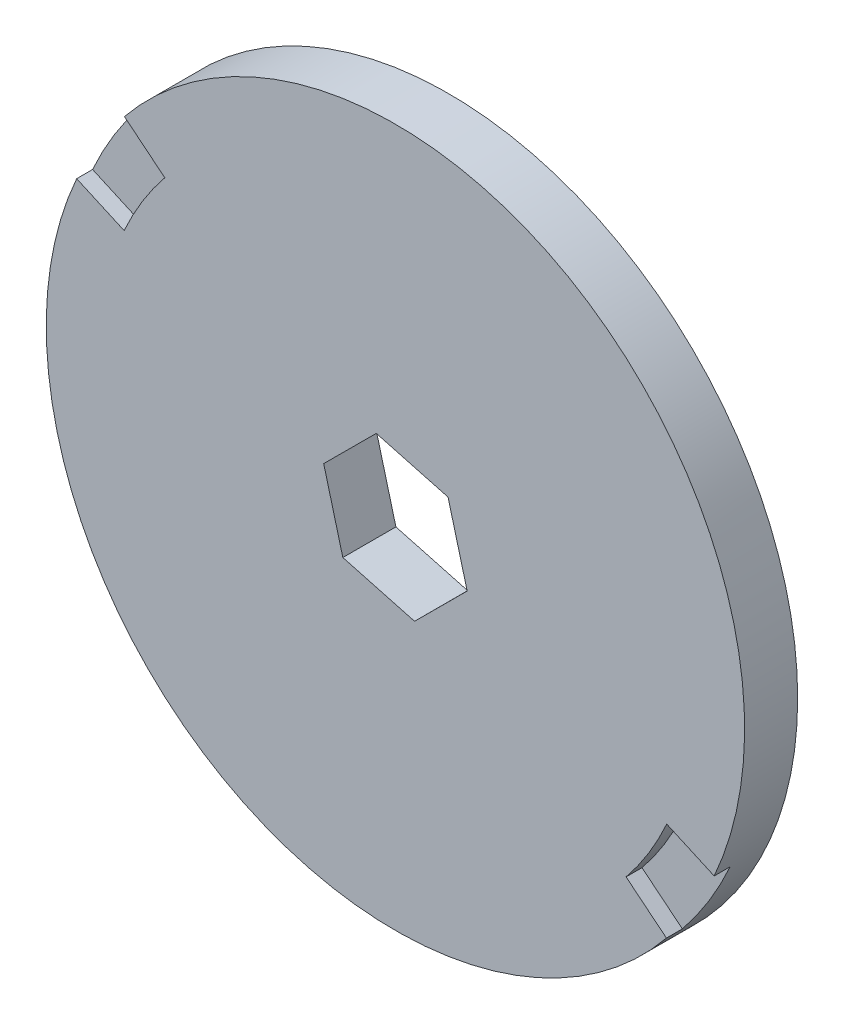
ISO-10303-21;
HEADER;
FILE_DESCRIPTION(('STEP AP214'),'2;1');
FILE_NAME('part.step','',(''),(''),'','','');
FILE_SCHEMA(('AUTOMOTIVE_DESIGN { 1 0 10303 214 1 1 1 1 }'));
ENDSEC;
DATA;
#1=APPLICATION_CONTEXT('core data for automotive mechanical design processes');
#2=APPLICATION_PROTOCOL_DEFINITION('international standard','automotive_design',2000,#1);
#3=PRODUCT_CONTEXT('',#1,'mechanical');
#4=PRODUCT('Part','Part','',(#3));
#5=PRODUCT_RELATED_PRODUCT_CATEGORY('part','',(#4));
#6=PRODUCT_DEFINITION_FORMATION('','',#4);
#7=PRODUCT_DEFINITION_CONTEXT('part definition',#1,'design');
#8=PRODUCT_DEFINITION('design','',#6,#7);
#9=PRODUCT_DEFINITION_SHAPE('','',#8);
#10=(LENGTH_UNIT() NAMED_UNIT(*) SI_UNIT(.MILLI.,.METRE.));
#11=(NAMED_UNIT(*) PLANE_ANGLE_UNIT() SI_UNIT($,.RADIAN.));
#12=(NAMED_UNIT(*) SI_UNIT($,.STERADIAN.) SOLID_ANGLE_UNIT());
#13=UNCERTAINTY_MEASURE_WITH_UNIT(LENGTH_MEASURE(1.E-05),#10,'distance_accuracy_value','');
#14=(GEOMETRIC_REPRESENTATION_CONTEXT(3) GLOBAL_UNCERTAINTY_ASSIGNED_CONTEXT((#13)) GLOBAL_UNIT_ASSIGNED_CONTEXT((#10,
#11,#12)) REPRESENTATION_CONTEXT('',''));
#15=CARTESIAN_POINT('',(0.,0.,0.));
#16=DIRECTION('',(0.,0.,1.));
#17=DIRECTION('',(1.,0.,0.));
#18=AXIS2_PLACEMENT_3D('',#15,#16,#17);
#19=CARTESIAN_POINT('',(0.,0.,5.));
#20=DIRECTION('',(0.,0.,1.));
#21=DIRECTION('',(1.,0.,0.));
#22=AXIS2_PLACEMENT_3D('',#19,#20,#21);
#23=PLANE('',#22);
#24=DIRECTION('',(0.776077913826324,-0.630637036393345,0.));
#25=VECTOR('',#24,1.);
#26=CARTESIAN_POINT('',(21.7301815871371,-17.6578370190137,5.));
#27=LINE('',#26,#25);
#28=CARTESIAN_POINT('',(21.7301815871371,-17.6578370190137,5.));
#29=VERTEX_POINT('',#28);
#30=CARTESIAN_POINT('',(25.532963364886,-20.7479584973411,5.));
#31=VERTEX_POINT('',#30);
#32=EDGE_CURVE('E163',#29,#31,#27,.T.);
#33=ORIENTED_EDGE('',*,*,#32,.F.);
#34=CARTESIAN_POINT('',(0.,0.,5.));
#35=DIRECTION('',(0.,0.,-1.));
#36=DIRECTION('',(1.,0.,0.));
#37=AXIS2_PLACEMENT_3D('',#34,#35,#36);
#38=CIRCLE('',#37,28.);
#39=CARTESIAN_POINT('',(25.5599281208038,-11.4319759647815,5.));
#40=VERTEX_POINT('',#39);
#41=EDGE_CURVE('E271',#40,#29,#38,.T.);
#42=ORIENTED_EDGE('',*,*,#41,.F.);
#43=DIRECTION('',(-0.912854575742995,0.408284855885051,0.));
#44=VECTOR('',#43,1.);
#45=CARTESIAN_POINT('',(30.0329155419445,-13.4325717586182,5.));
#46=LINE('',#45,#44);
#47=CARTESIAN_POINT('',(30.0329155419445,-13.4325717586182,5.));
#48=VERTEX_POINT('',#47);
#49=EDGE_CURVE('E254',#48,#40,#46,.T.);
#50=ORIENTED_EDGE('',*,*,#49,.F.);
#51=CARTESIAN_POINT('',(0.,0.,5.));
#52=DIRECTION('',(0.,0.,1.));
#53=DIRECTION('',(1.,0.,0.));
#54=AXIS2_PLACEMENT_3D('',#51,#52,#53);
#55=CIRCLE('',#54,32.9);
#56=CARTESIAN_POINT('',(-25.532963364886,20.7479584973411,5.));
#57=VERTEX_POINT('',#56);
#58=EDGE_CURVE('E52',#48,#57,#55,.T.);
#59=ORIENTED_EDGE('',*,*,#58,.T.);
#60=DIRECTION('',(-0.776077913826324,0.630637036393345,0.));
#61=VECTOR('',#60,1.);
#62=CARTESIAN_POINT('',(-21.7301815871371,17.6578370190137,5.));
#63=LINE('',#62,#61);
#64=CARTESIAN_POINT('',(-21.7301815871371,17.6578370190137,5.));
#65=VERTEX_POINT('',#64);
#66=EDGE_CURVE('E177',#65,#57,#63,.T.);
#67=ORIENTED_EDGE('',*,*,#66,.F.);
#68=CARTESIAN_POINT('',(0.,0.,5.));
#69=DIRECTION('',(0.,0.,-1.));
#70=DIRECTION('',(-1.,0.,0.));
#71=AXIS2_PLACEMENT_3D('',#68,#69,#70);
#72=CIRCLE('',#71,28.);
#73=CARTESIAN_POINT('',(-25.5599281208038,11.4319759647815,5.));
#74=VERTEX_POINT('',#73);
#75=EDGE_CURVE('E187',#74,#65,#72,.T.);
#76=ORIENTED_EDGE('',*,*,#75,.F.);
#77=DIRECTION('',(0.912854575742995,-0.408284855885051,0.));
#78=VECTOR('',#77,1.);
#79=CARTESIAN_POINT('',(-30.0329155419445,13.4325717586182,5.));
#80=LINE('',#79,#78);
#81=CARTESIAN_POINT('',(-30.0329155419445,13.4325717586182,5.));
#82=VERTEX_POINT('',#81);
#83=EDGE_CURVE('E184',#82,#74,#80,.T.);
#84=ORIENTED_EDGE('',*,*,#83,.F.);
#85=EDGE_CURVE('E11',#82,#31,#55,.T.);
#86=ORIENTED_EDGE('',*,*,#85,.T.);
#87=EDGE_LOOP('',(#33,#42,#50,#59,#67,#76,#84,#86));
#88=FACE_BOUND('',#87,.T.);
#89=DIRECTION('',(-0.25760001608588,0.966251639953358,0.));
#90=VECTOR('',#89,1.);
#91=CARTESIAN_POINT('',(6.75918932283646,-1.82026363421719,5.));
#92=LINE('',#91,#90);
#93=CARTESIAN_POINT('',(6.75918932283646,-1.82026363421719,5.));
#94=VERTEX_POINT('',#93);
#95=CARTESIAN_POINT('',(4.9559892102353,4.94349784545632,5.));
#96=VERTEX_POINT('',#95);
#97=EDGE_CURVE('E203',#94,#96,#92,.T.);
#98=ORIENTED_EDGE('',*,*,#97,.F.);
#99=DIRECTION('',(0.707998458605043,0.706213977922331,0.));
#100=VECTOR('',#99,1.);
#101=CARTESIAN_POINT('',(1.80320011260116,-6.76376147967351,5.));
#102=LINE('',#101,#100);
#103=CARTESIAN_POINT('',(1.80320011260116,-6.76376147967351,5.));
#104=VERTEX_POINT('',#103);
#105=EDGE_CURVE('E201',#104,#94,#102,.T.);
#106=ORIENTED_EDGE('',*,*,#105,.F.);
#107=DIRECTION('',(0.965598474690923,-0.260037662031027,0.));
#108=VECTOR('',#107,1.);
#109=CARTESIAN_POINT('',(-4.9559892102353,-4.94349784545632,5.));
#110=LINE('',#109,#108);
#111=CARTESIAN_POINT('',(-4.9559892102353,-4.94349784545632,5.));
#112=VERTEX_POINT('',#111);
#113=EDGE_CURVE('E213',#112,#104,#110,.T.);
#114=ORIENTED_EDGE('',*,*,#113,.F.);
#115=DIRECTION('',(0.25760001608588,-0.966251639953358,0.));
#116=VECTOR('',#115,1.);
#117=CARTESIAN_POINT('',(-6.75918932283646,1.82026363421719,5.));
#118=LINE('',#117,#116);
#119=CARTESIAN_POINT('',(-6.75918932283646,1.82026363421719,5.));
#120=VERTEX_POINT('',#119);
#121=EDGE_CURVE('E210',#120,#112,#118,.T.);
#122=ORIENTED_EDGE('',*,*,#121,.F.);
#123=DIRECTION('',(-0.707998458605043,-0.706213977922331,0.));
#124=VECTOR('',#123,1.);
#125=CARTESIAN_POINT('',(-1.80320011260116,6.76376147967351,5.));
#126=LINE('',#125,#124);
#127=CARTESIAN_POINT('',(-1.80320011260116,6.76376147967351,5.));
#128=VERTEX_POINT('',#127);
#129=EDGE_CURVE('E208',#128,#120,#126,.T.);
#130=ORIENTED_EDGE('',*,*,#129,.F.);
#131=DIRECTION('',(-0.965598474690923,0.260037662031027,0.));
#132=VECTOR('',#131,1.);
#133=CARTESIAN_POINT('',(4.9559892102353,4.94349784545632,5.));
#134=LINE('',#133,#132);
#135=EDGE_CURVE('E206',#96,#128,#134,.T.);
#136=ORIENTED_EDGE('',*,*,#135,.F.);
#137=EDGE_LOOP('',(#98,#106,#114,#122,#130,#136));
#138=FACE_BOUND('',#137,.T.);
#139=ADVANCED_FACE('F43',(#88,#138),#23,.T.);
#140=CARTESIAN_POINT('',(0.,0.,0.));
#141=DIRECTION('',(0.,0.,1.));
#142=DIRECTION('',(1.,0.,0.));
#143=AXIS2_PLACEMENT_3D('',#140,#141,#142);
#144=PLANE('',#143);
#145=CARTESIAN_POINT('',(0.,0.,0.));
#146=DIRECTION('',(0.,0.,1.));
#147=DIRECTION('',(1.,0.,0.));
#148=AXIS2_PLACEMENT_3D('',#145,#146,#147);
#149=CIRCLE('',#148,32.9);
#150=CARTESIAN_POINT('',(32.9,0.,0.));
#151=VERTEX_POINT('',#150);
#152=EDGE_CURVE('E47',#151,#151,#149,.T.);
#153=ORIENTED_EDGE('',*,*,#152,.F.);
#154=EDGE_LOOP('',(#153));
#155=FACE_BOUND('',#154,.T.);
#156=DIRECTION('',(0.707998458605043,0.706213977922331,0.));
#157=VECTOR('',#156,1.);
#158=CARTESIAN_POINT('',(1.80320011260116,-6.76376147967351,0.));
#159=LINE('',#158,#157);
#160=CARTESIAN_POINT('',(1.80320011260116,-6.76376147967351,0.));
#161=VERTEX_POINT('',#160);
#162=CARTESIAN_POINT('',(6.75918932283646,-1.82026363421719,0.));
#163=VERTEX_POINT('',#162);
#164=EDGE_CURVE('E195',#161,#163,#159,.T.);
#165=ORIENTED_EDGE('',*,*,#164,.T.);
#166=DIRECTION('',(-0.25760001608588,0.966251639953358,0.));
#167=VECTOR('',#166,1.);
#168=CARTESIAN_POINT('',(6.75918932283646,-1.82026363421719,0.));
#169=LINE('',#168,#167);
#170=CARTESIAN_POINT('',(4.9559892102353,4.94349784545632,0.));
#171=VERTEX_POINT('',#170);
#172=EDGE_CURVE('E218',#163,#171,#169,.T.);
#173=ORIENTED_EDGE('',*,*,#172,.T.);
#174=DIRECTION('',(-0.965598474690923,0.260037662031027,0.));
#175=VECTOR('',#174,1.);
#176=CARTESIAN_POINT('',(4.9559892102353,4.94349784545632,0.));
#177=LINE('',#176,#175);
#178=CARTESIAN_POINT('',(-1.80320011260116,6.76376147967351,0.));
#179=VERTEX_POINT('',#178);
#180=EDGE_CURVE('E221',#171,#179,#177,.T.);
#181=ORIENTED_EDGE('',*,*,#180,.T.);
#182=DIRECTION('',(-0.707998458605043,-0.706213977922331,0.));
#183=VECTOR('',#182,1.);
#184=CARTESIAN_POINT('',(-1.80320011260116,6.76376147967351,0.));
#185=LINE('',#184,#183);
#186=CARTESIAN_POINT('',(-6.75918932283646,1.82026363421719,0.));
#187=VERTEX_POINT('',#186);
#188=EDGE_CURVE('E224',#179,#187,#185,.T.);
#189=ORIENTED_EDGE('',*,*,#188,.T.);
#190=DIRECTION('',(0.25760001608588,-0.966251639953358,0.));
#191=VECTOR('',#190,1.);
#192=CARTESIAN_POINT('',(-6.75918932283646,1.82026363421719,0.));
#193=LINE('',#192,#191);
#194=CARTESIAN_POINT('',(-4.9559892102353,-4.94349784545632,0.));
#195=VERTEX_POINT('',#194);
#196=EDGE_CURVE('E227',#187,#195,#193,.T.);
#197=ORIENTED_EDGE('',*,*,#196,.T.);
#198=DIRECTION('',(0.965598474690923,-0.260037662031027,0.));
#199=VECTOR('',#198,1.);
#200=CARTESIAN_POINT('',(-4.9559892102353,-4.94349784545632,0.));
#201=LINE('',#200,#199);
#202=EDGE_CURVE('E204',#195,#161,#201,.T.);
#203=ORIENTED_EDGE('',*,*,#202,.T.);
#204=EDGE_LOOP('',(#165,#173,#181,#189,#197,#203));
#205=FACE_BOUND('',#204,.T.);
#206=ADVANCED_FACE('F287',(#155,#205),#144,.F.);
#207=CARTESIAN_POINT('',(0.,0.,5.));
#208=DIRECTION('',(0.,0.,-1.));
#209=DIRECTION('',(-1.,0.,0.));
#210=AXIS2_PLACEMENT_3D('',#207,#208,#209);
#211=CYLINDRICAL_SURFACE('',#210,32.9);
#212=CARTESIAN_POINT('',(0.,0.,3.5));
#213=DIRECTION('',(0.,0.,1.));
#214=DIRECTION('',(1.,0.,0.));
#215=AXIS2_PLACEMENT_3D('',#212,#213,#214);
#216=CIRCLE('',#215,32.9);
#217=CARTESIAN_POINT('',(25.532963364886,-20.7479584973411,3.5));
#218=VERTEX_POINT('',#217);
#219=CARTESIAN_POINT('',(30.0329155419445,-13.4325717586182,3.5));
#220=VERTEX_POINT('',#219);
#221=EDGE_CURVE('E157',#218,#220,#216,.T.);
#222=ORIENTED_EDGE('',*,*,#221,.F.);
#223=DIRECTION('',(0.,0.,1.));
#224=VECTOR('',#223,1.);
#225=CARTESIAN_POINT('',(25.532963364886,-20.7479584973411,3.5));
#226=LINE('',#225,#224);
#227=EDGE_CURVE('E188',#218,#31,#226,.T.);
#228=ORIENTED_EDGE('',*,*,#227,.T.);
#229=ORIENTED_EDGE('',*,*,#85,.F.);
#230=DIRECTION('',(0.,0.,1.));
#231=VECTOR('',#230,1.);
#232=CARTESIAN_POINT('',(-30.0329155419445,13.4325717586182,3.5));
#233=LINE('',#232,#231);
#234=CARTESIAN_POINT('',(-30.0329155419445,13.4325717586182,3.5));
#235=VERTEX_POINT('',#234);
#236=EDGE_CURVE('E183',#235,#82,#233,.T.);
#237=ORIENTED_EDGE('',*,*,#236,.F.);
#238=CARTESIAN_POINT('',(0.,0.,3.5));
#239=DIRECTION('',(0.,0.,1.));
#240=DIRECTION('',(-1.,0.,0.));
#241=AXIS2_PLACEMENT_3D('',#238,#239,#240);
#242=CIRCLE('',#241,32.9);
#243=CARTESIAN_POINT('',(-25.532963364886,20.7479584973411,3.5));
#244=VERTEX_POINT('',#243);
#245=EDGE_CURVE('E174',#244,#235,#242,.T.);
#246=ORIENTED_EDGE('',*,*,#245,.F.);
#247=DIRECTION('',(0.,0.,1.));
#248=VECTOR('',#247,1.);
#249=CARTESIAN_POINT('',(-25.532963364886,20.7479584973411,3.5));
#250=LINE('',#249,#248);
#251=EDGE_CURVE('E193',#244,#57,#250,.T.);
#252=ORIENTED_EDGE('',*,*,#251,.T.);
#253=ORIENTED_EDGE('',*,*,#58,.F.);
#254=DIRECTION('',(0.,0.,1.));
#255=VECTOR('',#254,1.);
#256=CARTESIAN_POINT('',(30.0329155419445,-13.4325717586182,3.5));
#257=LINE('',#256,#255);
#258=EDGE_CURVE('E152',#220,#48,#257,.T.);
#259=ORIENTED_EDGE('',*,*,#258,.F.);
#260=EDGE_LOOP('',(#222,#228,#229,#237,#246,#252,#253,#259));
#261=FACE_BOUND('',#260,.T.);
#262=ORIENTED_EDGE('',*,*,#152,.T.);
#263=EDGE_LOOP('',(#262));
#264=FACE_BOUND('',#263,.T.);
#265=ADVANCED_FACE('F45',(#261,#264),#211,.T.);
#266=CARTESIAN_POINT('',(1.80320011260116,-6.76376147967351,5.));
#267=DIRECTION('',(-0.706213977922331,0.707998458605043,0.));
#268=DIRECTION('',(-0.707998458605043,-0.706213977922331,0.));
#269=AXIS2_PLACEMENT_3D('',#266,#267,#268);
#270=PLANE('',#269);
#271=ORIENTED_EDGE('',*,*,#164,.F.);
#272=DIRECTION('',(0.,0.,-1.));
#273=VECTOR('',#272,1.);
#274=CARTESIAN_POINT('',(1.80320011260116,-6.76376147967351,5.));
#275=LINE('',#274,#273);
#276=EDGE_CURVE('E215',#104,#161,#275,.T.);
#277=ORIENTED_EDGE('',*,*,#276,.F.);
#278=ORIENTED_EDGE('',*,*,#105,.T.);
#279=DIRECTION('',(0.,0.,-1.));
#280=VECTOR('',#279,1.);
#281=CARTESIAN_POINT('',(6.75918932283646,-1.82026363421719,5.));
#282=LINE('',#281,#280);
#283=EDGE_CURVE('E242',#94,#163,#282,.T.);
#284=ORIENTED_EDGE('',*,*,#283,.T.);
#285=EDGE_LOOP('',(#271,#277,#278,#284));
#286=FACE_BOUND('',#285,.T.);
#287=ADVANCED_FACE('F296',(#286),#270,.T.);
#288=CARTESIAN_POINT('',(6.75918932283646,-1.82026363421719,5.));
#289=DIRECTION('',(-0.966251639953358,-0.25760001608588,0.));
#290=DIRECTION('',(0.25760001608588,-0.966251639953358,0.));
#291=AXIS2_PLACEMENT_3D('',#288,#289,#290);
#292=PLANE('',#291);
#293=ORIENTED_EDGE('',*,*,#172,.F.);
#294=ORIENTED_EDGE('',*,*,#283,.F.);
#295=ORIENTED_EDGE('',*,*,#97,.T.);
#296=DIRECTION('',(0.,0.,-1.));
#297=VECTOR('',#296,1.);
#298=CARTESIAN_POINT('',(4.9559892102353,4.94349784545632,5.));
#299=LINE('',#298,#297);
#300=EDGE_CURVE('E240',#96,#171,#299,.T.);
#301=ORIENTED_EDGE('',*,*,#300,.T.);
#302=EDGE_LOOP('',(#293,#294,#295,#301));
#303=FACE_BOUND('',#302,.T.);
#304=ADVANCED_FACE('F299',(#303),#292,.T.);
#305=CARTESIAN_POINT('',(4.9559892102353,4.94349784545632,5.));
#306=DIRECTION('',(-0.260037662031027,-0.965598474690923,0.));
#307=DIRECTION('',(0.965598474690923,-0.260037662031027,0.));
#308=AXIS2_PLACEMENT_3D('',#305,#306,#307);
#309=PLANE('',#308);
#310=ORIENTED_EDGE('',*,*,#180,.F.);
#311=ORIENTED_EDGE('',*,*,#300,.F.);
#312=ORIENTED_EDGE('',*,*,#135,.T.);
#313=DIRECTION('',(0.,0.,-1.));
#314=VECTOR('',#313,1.);
#315=CARTESIAN_POINT('',(-1.80320011260116,6.76376147967351,5.));
#316=LINE('',#315,#314);
#317=EDGE_CURVE('E238',#128,#179,#316,.T.);
#318=ORIENTED_EDGE('',*,*,#317,.T.);
#319=EDGE_LOOP('',(#310,#311,#312,#318));
#320=FACE_BOUND('',#319,.T.);
#321=ADVANCED_FACE('F302',(#320),#309,.T.);
#322=CARTESIAN_POINT('',(-1.80320011260116,6.76376147967351,5.));
#323=DIRECTION('',(0.706213977922331,-0.707998458605043,0.));
#324=DIRECTION('',(0.707998458605043,0.706213977922331,0.));
#325=AXIS2_PLACEMENT_3D('',#322,#323,#324);
#326=PLANE('',#325);
#327=ORIENTED_EDGE('',*,*,#188,.F.);
#328=ORIENTED_EDGE('',*,*,#317,.F.);
#329=ORIENTED_EDGE('',*,*,#129,.T.);
#330=DIRECTION('',(0.,0.,-1.));
#331=VECTOR('',#330,1.);
#332=CARTESIAN_POINT('',(-6.75918932283646,1.82026363421719,5.));
#333=LINE('',#332,#331);
#334=EDGE_CURVE('E236',#120,#187,#333,.T.);
#335=ORIENTED_EDGE('',*,*,#334,.T.);
#336=EDGE_LOOP('',(#327,#328,#329,#335));
#337=FACE_BOUND('',#336,.T.);
#338=ADVANCED_FACE('F306',(#337),#326,.T.);
#339=CARTESIAN_POINT('',(-6.75918932283646,1.82026363421719,5.));
#340=DIRECTION('',(0.966251639953358,0.25760001608588,0.));
#341=DIRECTION('',(-0.25760001608588,0.966251639953358,0.));
#342=AXIS2_PLACEMENT_3D('',#339,#340,#341);
#343=PLANE('',#342);
#344=ORIENTED_EDGE('',*,*,#196,.F.);
#345=ORIENTED_EDGE('',*,*,#334,.F.);
#346=ORIENTED_EDGE('',*,*,#121,.T.);
#347=DIRECTION('',(0.,0.,-1.));
#348=VECTOR('',#347,1.);
#349=CARTESIAN_POINT('',(-4.9559892102353,-4.94349784545632,5.));
#350=LINE('',#349,#348);
#351=EDGE_CURVE('E234',#112,#195,#350,.T.);
#352=ORIENTED_EDGE('',*,*,#351,.T.);
#353=EDGE_LOOP('',(#344,#345,#346,#352));
#354=FACE_BOUND('',#353,.T.);
#355=ADVANCED_FACE('F310',(#354),#343,.T.);
#356=CARTESIAN_POINT('',(-4.9559892102353,-4.94349784545632,5.));
#357=DIRECTION('',(0.260037662031027,0.965598474690923,0.));
#358=DIRECTION('',(-0.965598474690923,0.260037662031027,0.));
#359=AXIS2_PLACEMENT_3D('',#356,#357,#358);
#360=PLANE('',#359);
#361=ORIENTED_EDGE('',*,*,#202,.F.);
#362=ORIENTED_EDGE('',*,*,#351,.F.);
#363=ORIENTED_EDGE('',*,*,#113,.T.);
#364=ORIENTED_EDGE('',*,*,#276,.T.);
#365=EDGE_LOOP('',(#361,#362,#363,#364));
#366=FACE_BOUND('',#365,.T.);
#367=ADVANCED_FACE('F314',(#366),#360,.T.);
#368=CARTESIAN_POINT('',(-21.7301815871371,17.6578370190137,3.5));
#369=DIRECTION('',(0.630637036393345,0.776077913826324,0.));
#370=DIRECTION('',(-0.776077913826324,0.630637036393345,0.));
#371=AXIS2_PLACEMENT_3D('',#368,#369,#370);
#372=PLANE('',#371);
#373=ORIENTED_EDGE('',*,*,#66,.T.);
#374=ORIENTED_EDGE('',*,*,#251,.F.);
#375=DIRECTION('',(-0.776077913826324,0.630637036393345,0.));
#376=VECTOR('',#375,1.);
#377=CARTESIAN_POINT('',(-21.7301815871371,17.6578370190137,3.5));
#378=LINE('',#377,#376);
#379=CARTESIAN_POINT('',(-21.7301815871371,17.6578370190137,3.5));
#380=VERTEX_POINT('',#379);
#381=EDGE_CURVE('E67',#380,#244,#378,.T.);
#382=ORIENTED_EDGE('',*,*,#381,.F.);
#383=DIRECTION('',(0.,0.,1.));
#384=VECTOR('',#383,1.);
#385=CARTESIAN_POINT('',(-21.7301815871371,17.6578370190137,3.5));
#386=LINE('',#385,#384);
#387=EDGE_CURVE('E196',#380,#65,#386,.T.);
#388=ORIENTED_EDGE('',*,*,#387,.T.);
#389=EDGE_LOOP('',(#373,#374,#382,#388));
#390=FACE_BOUND('',#389,.T.);
#391=ADVANCED_FACE('F256',(#390),#372,.F.);
#392=CARTESIAN_POINT('',(0.,0.,3.5));
#393=DIRECTION('',(0.,0.,1.));
#394=DIRECTION('',(1.,0.,0.));
#395=AXIS2_PLACEMENT_3D('',#392,#393,#394);
#396=CYLINDRICAL_SURFACE('',#395,28.);
#397=ORIENTED_EDGE('',*,*,#75,.T.);
#398=ORIENTED_EDGE('',*,*,#387,.F.);
#399=CARTESIAN_POINT('',(0.,0.,3.5));
#400=DIRECTION('',(0.,0.,-1.));
#401=DIRECTION('',(-1.,0.,0.));
#402=AXIS2_PLACEMENT_3D('',#399,#400,#401);
#403=CIRCLE('',#402,28.);
#404=CARTESIAN_POINT('',(-25.5599281208038,11.4319759647815,3.5));
#405=VERTEX_POINT('',#404);
#406=EDGE_CURVE('E180',#405,#380,#403,.T.);
#407=ORIENTED_EDGE('',*,*,#406,.F.);
#408=DIRECTION('',(0.,0.,1.));
#409=VECTOR('',#408,1.);
#410=CARTESIAN_POINT('',(-25.5599281208038,11.4319759647815,3.5));
#411=LINE('',#410,#409);
#412=EDGE_CURVE('E198',#405,#74,#411,.T.);
#413=ORIENTED_EDGE('',*,*,#412,.T.);
#414=EDGE_LOOP('',(#397,#398,#407,#413));
#415=FACE_BOUND('',#414,.T.);
#416=ADVANCED_FACE('F266',(#415),#396,.T.);
#417=CARTESIAN_POINT('',(-30.0329155419445,13.4325717586182,3.5));
#418=DIRECTION('',(-0.408284855885051,-0.912854575742995,0.));
#419=DIRECTION('',(0.912854575742995,-0.408284855885051,0.));
#420=AXIS2_PLACEMENT_3D('',#417,#418,#419);
#421=PLANE('',#420);
#422=ORIENTED_EDGE('',*,*,#83,.T.);
#423=ORIENTED_EDGE('',*,*,#412,.F.);
#424=DIRECTION('',(0.912854575742995,-0.408284855885051,0.));
#425=VECTOR('',#424,1.);
#426=CARTESIAN_POINT('',(-30.0329155419445,13.4325717586182,3.5));
#427=LINE('',#426,#425);
#428=EDGE_CURVE('E176',#235,#405,#427,.T.);
#429=ORIENTED_EDGE('',*,*,#428,.F.);
#430=ORIENTED_EDGE('',*,*,#236,.T.);
#431=EDGE_LOOP('',(#422,#423,#429,#430));
#432=FACE_BOUND('',#431,.T.);
#433=ADVANCED_FACE('F263',(#432),#421,.F.);
#434=CARTESIAN_POINT('',(0.,0.,3.5));
#435=DIRECTION('',(0.,0.,-1.));
#436=DIRECTION('',(-1.,0.,0.));
#437=AXIS2_PLACEMENT_3D('',#434,#435,#436);
#438=PLANE('',#437);
#439=ORIENTED_EDGE('',*,*,#245,.T.);
#440=ORIENTED_EDGE('',*,*,#428,.T.);
#441=ORIENTED_EDGE('',*,*,#406,.T.);
#442=ORIENTED_EDGE('',*,*,#381,.T.);
#443=EDGE_LOOP('',(#439,#440,#441,#442));
#444=FACE_BOUND('',#443,.T.);
#445=ADVANCED_FACE('F260',(#444),#438,.F.);
#446=CARTESIAN_POINT('',(21.7301815871371,-17.6578370190137,3.5));
#447=DIRECTION('',(-0.630637036393345,-0.776077913826324,0.));
#448=DIRECTION('',(0.776077913826324,-0.630637036393345,0.));
#449=AXIS2_PLACEMENT_3D('',#446,#447,#448);
#450=PLANE('',#449);
#451=ORIENTED_EDGE('',*,*,#32,.T.);
#452=ORIENTED_EDGE('',*,*,#227,.F.);
#453=DIRECTION('',(0.776077913826324,-0.630637036393345,0.));
#454=VECTOR('',#453,1.);
#455=CARTESIAN_POINT('',(21.7301815871371,-17.6578370190137,3.5));
#456=LINE('',#455,#454);
#457=CARTESIAN_POINT('',(21.7301815871371,-17.6578370190137,3.5));
#458=VERTEX_POINT('',#457);
#459=EDGE_CURVE('E59',#458,#218,#456,.T.);
#460=ORIENTED_EDGE('',*,*,#459,.F.);
#461=DIRECTION('',(0.,0.,1.));
#462=VECTOR('',#461,1.);
#463=CARTESIAN_POINT('',(21.7301815871371,-17.6578370190137,3.5));
#464=LINE('',#463,#462);
#465=EDGE_CURVE('E169',#458,#29,#464,.T.);
#466=ORIENTED_EDGE('',*,*,#465,.T.);
#467=EDGE_LOOP('',(#451,#452,#460,#466));
#468=FACE_BOUND('',#467,.T.);
#469=ADVANCED_FACE('F276',(#468),#450,.F.);
#470=CARTESIAN_POINT('',(0.,0.,3.5));
#471=DIRECTION('',(0.,0.,1.));
#472=DIRECTION('',(1.,0.,0.));
#473=AXIS2_PLACEMENT_3D('',#470,#471,#472);
#474=CYLINDRICAL_SURFACE('',#473,28.);
#475=ORIENTED_EDGE('',*,*,#41,.T.);
#476=ORIENTED_EDGE('',*,*,#465,.F.);
#477=CARTESIAN_POINT('',(0.,0.,3.5));
#478=DIRECTION('',(0.,0.,-1.));
#479=DIRECTION('',(1.,0.,0.));
#480=AXIS2_PLACEMENT_3D('',#477,#478,#479);
#481=CIRCLE('',#480,28.);
#482=CARTESIAN_POINT('',(25.5599281208038,-11.4319759647815,3.5));
#483=VERTEX_POINT('',#482);
#484=EDGE_CURVE('E156',#483,#458,#481,.T.);
#485=ORIENTED_EDGE('',*,*,#484,.F.);
#486=DIRECTION('',(0.,0.,1.));
#487=VECTOR('',#486,1.);
#488=CARTESIAN_POINT('',(25.5599281208038,-11.4319759647815,3.5));
#489=LINE('',#488,#487);
#490=EDGE_CURVE('E154',#483,#40,#489,.T.);
#491=ORIENTED_EDGE('',*,*,#490,.T.);
#492=EDGE_LOOP('',(#475,#476,#485,#491));
#493=FACE_BOUND('',#492,.T.);
#494=ADVANCED_FACE('F277',(#493),#474,.T.);
#495=CARTESIAN_POINT('',(30.0329155419445,-13.4325717586182,3.5));
#496=DIRECTION('',(0.408284855885051,0.912854575742995,0.));
#497=DIRECTION('',(-0.912854575742995,0.408284855885051,0.));
#498=AXIS2_PLACEMENT_3D('',#495,#496,#497);
#499=PLANE('',#498);
#500=ORIENTED_EDGE('',*,*,#49,.T.);
#501=ORIENTED_EDGE('',*,*,#490,.F.);
#502=DIRECTION('',(-0.912854575742995,0.408284855885051,0.));
#503=VECTOR('',#502,1.);
#504=CARTESIAN_POINT('',(30.0329155419445,-13.4325717586182,3.5));
#505=LINE('',#504,#503);
#506=EDGE_CURVE('E148',#220,#483,#505,.T.);
#507=ORIENTED_EDGE('',*,*,#506,.F.);
#508=ORIENTED_EDGE('',*,*,#258,.T.);
#509=EDGE_LOOP('',(#500,#501,#507,#508));
#510=FACE_BOUND('',#509,.T.);
#511=ADVANCED_FACE('F150',(#510),#499,.F.);
#512=CARTESIAN_POINT('',(0.,0.,3.5));
#513=DIRECTION('',(0.,0.,-1.));
#514=DIRECTION('',(1.,0.,0.));
#515=AXIS2_PLACEMENT_3D('',#512,#513,#514);
#516=PLANE('',#515);
#517=ORIENTED_EDGE('',*,*,#221,.T.);
#518=ORIENTED_EDGE('',*,*,#506,.T.);
#519=ORIENTED_EDGE('',*,*,#484,.T.);
#520=ORIENTED_EDGE('',*,*,#459,.T.);
#521=EDGE_LOOP('',(#517,#518,#519,#520));
#522=FACE_BOUND('',#521,.T.);
#523=ADVANCED_FACE('F160',(#522),#516,.F.);
#524=CLOSED_SHELL('',(#139,#206,#265,#287,#304,#321,#338,#355,#367,#391,#416,#433,#445,#469,
#494,#511,#523));
#525=MANIFOLD_SOLID_BREP('B2',#524);
#526=ADVANCED_BREP_SHAPE_REPRESENTATION('',(#18,#525),#14);
#527=SHAPE_DEFINITION_REPRESENTATION(#9,#526);
ENDSEC;
END-ISO-10303-21;
